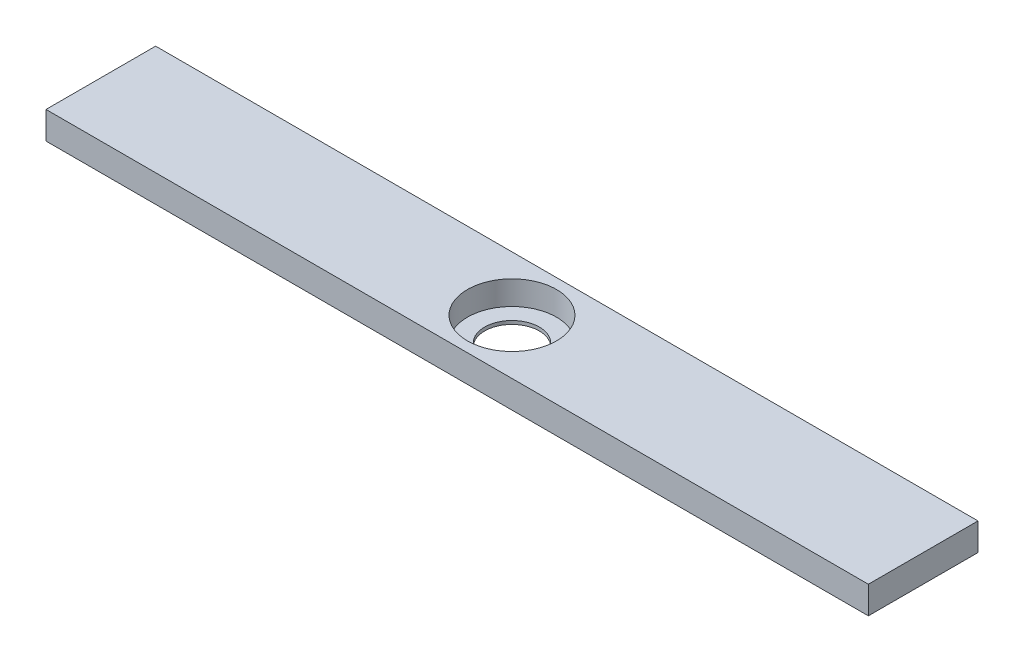
ISO-10303-21;
HEADER;
FILE_DESCRIPTION(('STEP AP214'),'2;1');
FILE_NAME('part.step','',(''),(''),'','','');
FILE_SCHEMA(('AUTOMOTIVE_DESIGN { 1 0 10303 214 1 1 1 1 }'));
ENDSEC;
DATA;
#1=APPLICATION_CONTEXT('core data for automotive mechanical design processes');
#2=APPLICATION_PROTOCOL_DEFINITION('international standard','automotive_design',2000,#1);
#3=PRODUCT_CONTEXT('',#1,'mechanical');
#4=PRODUCT('Part','Part','',(#3));
#5=PRODUCT_RELATED_PRODUCT_CATEGORY('part','',(#4));
#6=PRODUCT_DEFINITION_FORMATION('','',#4);
#7=PRODUCT_DEFINITION_CONTEXT('part definition',#1,'design');
#8=PRODUCT_DEFINITION('design','',#6,#7);
#9=PRODUCT_DEFINITION_SHAPE('','',#8);
#10=(LENGTH_UNIT() NAMED_UNIT(*) SI_UNIT(.MILLI.,.METRE.));
#11=(NAMED_UNIT(*) PLANE_ANGLE_UNIT() SI_UNIT($,.RADIAN.));
#12=(NAMED_UNIT(*) SI_UNIT($,.STERADIAN.) SOLID_ANGLE_UNIT());
#13=UNCERTAINTY_MEASURE_WITH_UNIT(LENGTH_MEASURE(1.E-05),#10,'distance_accuracy_value','');
#14=(GEOMETRIC_REPRESENTATION_CONTEXT(3) GLOBAL_UNCERTAINTY_ASSIGNED_CONTEXT((#13)) GLOBAL_UNIT_ASSIGNED_CONTEXT((#10,
#11,#12)) REPRESENTATION_CONTEXT('',''));
#15=CARTESIAN_POINT('',(0.,0.,0.));
#16=DIRECTION('',(0.,0.,1.));
#17=DIRECTION('',(1.,0.,0.));
#18=AXIS2_PLACEMENT_3D('',#15,#16,#17);
#19=CARTESIAN_POINT('',(190.5,12.7,-25.4));
#20=DIRECTION('',(-1.,0.,0.));
#21=DIRECTION('',(0.,0.,1.));
#22=AXIS2_PLACEMENT_3D('',#19,#20,#21);
#23=PLANE('',#22);
#24=DIRECTION('',(0.,0.,-1.));
#25=VECTOR('',#24,1.);
#26=CARTESIAN_POINT('',(190.5,0.,-25.4));
#27=LINE('',#26,#25);
#28=CARTESIAN_POINT('',(190.5,0.,25.4));
#29=VERTEX_POINT('',#28);
#30=CARTESIAN_POINT('',(190.5,0.,-25.4));
#31=VERTEX_POINT('',#30);
#32=EDGE_CURVE('E98',#29,#31,#27,.T.);
#33=ORIENTED_EDGE('',*,*,#32,.T.);
#34=DIRECTION('',(0.,-1.,0.));
#35=VECTOR('',#34,1.);
#36=CARTESIAN_POINT('',(190.5,12.7,-25.4));
#37=LINE('',#36,#35);
#38=CARTESIAN_POINT('',(190.5,12.7,-25.4));
#39=VERTEX_POINT('',#38);
#40=EDGE_CURVE('E11',#39,#31,#37,.T.);
#41=ORIENTED_EDGE('',*,*,#40,.F.);
#42=DIRECTION('',(0.,0.,-1.));
#43=VECTOR('',#42,1.);
#44=CARTESIAN_POINT('',(190.5,12.7,-25.4));
#45=LINE('',#44,#43);
#46=CARTESIAN_POINT('',(190.5,12.7,25.4));
#47=VERTEX_POINT('',#46);
#48=EDGE_CURVE('E86',#47,#39,#45,.T.);
#49=ORIENTED_EDGE('',*,*,#48,.F.);
#50=DIRECTION('',(0.,-1.,0.));
#51=VECTOR('',#50,1.);
#52=CARTESIAN_POINT('',(190.5,12.7,25.4));
#53=LINE('',#52,#51);
#54=EDGE_CURVE('E94',#47,#29,#53,.T.);
#55=ORIENTED_EDGE('',*,*,#54,.T.);
#56=EDGE_LOOP('',(#33,#41,#49,#55));
#57=FACE_BOUND('',#56,.T.);
#58=ADVANCED_FACE('F35',(#57),#23,.F.);
#59=CARTESIAN_POINT('',(-190.5,12.7,-25.4));
#60=DIRECTION('',(0.,0.,1.));
#61=DIRECTION('',(1.,0.,0.));
#62=AXIS2_PLACEMENT_3D('',#59,#60,#61);
#63=PLANE('',#62);
#64=DIRECTION('',(-1.,0.,0.));
#65=VECTOR('',#64,1.);
#66=CARTESIAN_POINT('',(-190.5,0.,-25.4));
#67=LINE('',#66,#65);
#68=CARTESIAN_POINT('',(-190.5,0.,-25.4));
#69=VERTEX_POINT('',#68);
#70=EDGE_CURVE('E90',#31,#69,#67,.T.);
#71=ORIENTED_EDGE('',*,*,#70,.T.);
#72=DIRECTION('',(0.,-1.,0.));
#73=VECTOR('',#72,1.);
#74=CARTESIAN_POINT('',(-190.5,12.7,-25.4));
#75=LINE('',#74,#73);
#76=CARTESIAN_POINT('',(-190.5,12.7,-25.4));
#77=VERTEX_POINT('',#76);
#78=EDGE_CURVE('E43',#77,#69,#75,.T.);
#79=ORIENTED_EDGE('',*,*,#78,.F.);
#80=DIRECTION('',(-1.,0.,0.));
#81=VECTOR('',#80,1.);
#82=CARTESIAN_POINT('',(-190.5,12.7,-25.4));
#83=LINE('',#82,#81);
#84=EDGE_CURVE('E81',#39,#77,#83,.T.);
#85=ORIENTED_EDGE('',*,*,#84,.F.);
#86=ORIENTED_EDGE('',*,*,#40,.T.);
#87=EDGE_LOOP('',(#71,#79,#85,#86));
#88=FACE_BOUND('',#87,.T.);
#89=ADVANCED_FACE('F89',(#88),#63,.F.);
#90=CARTESIAN_POINT('',(-190.5,12.7,-25.4));
#91=DIRECTION('',(1.,0.,0.));
#92=DIRECTION('',(0.,0.,-1.));
#93=AXIS2_PLACEMENT_3D('',#90,#91,#92);
#94=PLANE('',#93);
#95=DIRECTION('',(0.,0.,1.));
#96=VECTOR('',#95,1.);
#97=CARTESIAN_POINT('',(-190.5,0.,-25.4));
#98=LINE('',#97,#96);
#99=CARTESIAN_POINT('',(-190.5,0.,25.4));
#100=VERTEX_POINT('',#99);
#101=EDGE_CURVE('E68',#69,#100,#98,.T.);
#102=ORIENTED_EDGE('',*,*,#101,.T.);
#103=DIRECTION('',(0.,-1.,0.));
#104=VECTOR('',#103,1.);
#105=CARTESIAN_POINT('',(-190.5,12.7,25.4));
#106=LINE('',#105,#104);
#107=CARTESIAN_POINT('',(-190.5,12.7,25.4));
#108=VERTEX_POINT('',#107);
#109=EDGE_CURVE('E91',#108,#100,#106,.T.);
#110=ORIENTED_EDGE('',*,*,#109,.F.);
#111=DIRECTION('',(0.,0.,1.));
#112=VECTOR('',#111,1.);
#113=CARTESIAN_POINT('',(-190.5,12.7,-25.4));
#114=LINE('',#113,#112);
#115=EDGE_CURVE('E84',#77,#108,#114,.T.);
#116=ORIENTED_EDGE('',*,*,#115,.F.);
#117=ORIENTED_EDGE('',*,*,#78,.T.);
#118=EDGE_LOOP('',(#102,#110,#116,#117));
#119=FACE_BOUND('',#118,.T.);
#120=ADVANCED_FACE('F92',(#119),#94,.F.);
#121=CARTESIAN_POINT('',(-190.5,12.7,25.4));
#122=DIRECTION('',(0.,0.,-1.));
#123=DIRECTION('',(-1.,0.,0.));
#124=AXIS2_PLACEMENT_3D('',#121,#122,#123);
#125=PLANE('',#124);
#126=DIRECTION('',(1.,0.,0.));
#127=VECTOR('',#126,1.);
#128=CARTESIAN_POINT('',(-190.5,0.,25.4));
#129=LINE('',#128,#127);
#130=EDGE_CURVE('E74',#100,#29,#129,.T.);
#131=ORIENTED_EDGE('',*,*,#130,.T.);
#132=ORIENTED_EDGE('',*,*,#54,.F.);
#133=DIRECTION('',(1.,0.,0.));
#134=VECTOR('',#133,1.);
#135=CARTESIAN_POINT('',(-190.5,12.7,25.4));
#136=LINE('',#135,#134);
#137=EDGE_CURVE('E51',#108,#47,#136,.T.);
#138=ORIENTED_EDGE('',*,*,#137,.F.);
#139=ORIENTED_EDGE('',*,*,#109,.T.);
#140=EDGE_LOOP('',(#131,#132,#138,#139));
#141=FACE_BOUND('',#140,.T.);
#142=ADVANCED_FACE('F106',(#141),#125,.F.);
#143=CARTESIAN_POINT('',(190.5,12.7,25.4));
#144=DIRECTION('',(0.,1.,0.));
#145=DIRECTION('',(0.,0.,1.));
#146=AXIS2_PLACEMENT_3D('',#143,#144,#145);
#147=PLANE('',#146);
#148=CARTESIAN_POINT('',(0.,12.7,0.));
#149=DIRECTION('',(0.,1.,0.));
#150=DIRECTION('',(0.,0.,1.));
#151=AXIS2_PLACEMENT_3D('',#148,#149,#150);
#152=CIRCLE('',#151,20.6375);
#153=CARTESIAN_POINT('',(0.,12.7,20.6375));
#154=VERTEX_POINT('',#153);
#155=EDGE_CURVE('E112',#154,#154,#152,.T.);
#156=ORIENTED_EDGE('',*,*,#155,.F.);
#157=EDGE_LOOP('',(#156));
#158=FACE_BOUND('',#157,.T.);
#159=ORIENTED_EDGE('',*,*,#48,.T.);
#160=ORIENTED_EDGE('',*,*,#84,.T.);
#161=ORIENTED_EDGE('',*,*,#115,.T.);
#162=ORIENTED_EDGE('',*,*,#137,.T.);
#163=EDGE_LOOP('',(#159,#160,#161,#162));
#164=FACE_BOUND('',#163,.T.);
#165=ADVANCED_FACE('F82',(#158,#164),#147,.T.);
#166=CARTESIAN_POINT('',(190.5,0.,25.4));
#167=DIRECTION('',(0.,1.,0.));
#168=DIRECTION('',(0.,0.,1.));
#169=AXIS2_PLACEMENT_3D('',#166,#167,#168);
#170=PLANE('',#169);
#171=CARTESIAN_POINT('',(0.,0.,0.));
#172=DIRECTION('',(0.,1.,0.));
#173=DIRECTION('',(0.,0.,1.));
#174=AXIS2_PLACEMENT_3D('',#171,#172,#173);
#175=CIRCLE('',#174,12.7);
#176=CARTESIAN_POINT('',(0.,0.,12.7));
#177=VERTEX_POINT('',#176);
#178=EDGE_CURVE('E115',#177,#177,#175,.T.);
#179=ORIENTED_EDGE('',*,*,#178,.T.);
#180=EDGE_LOOP('',(#179));
#181=FACE_BOUND('',#180,.T.);
#182=ORIENTED_EDGE('',*,*,#32,.F.);
#183=ORIENTED_EDGE('',*,*,#130,.F.);
#184=ORIENTED_EDGE('',*,*,#101,.F.);
#185=ORIENTED_EDGE('',*,*,#70,.F.);
#186=EDGE_LOOP('',(#182,#183,#184,#185));
#187=FACE_BOUND('',#186,.T.);
#188=ADVANCED_FACE('F109',(#181,#187),#170,.F.);
#189=CARTESIAN_POINT('',(0.,1.5875,0.));
#190=DIRECTION('',(0.,1.,0.));
#191=DIRECTION('',(0.,0.,1.));
#192=AXIS2_PLACEMENT_3D('',#189,#190,#191);
#193=CYLINDRICAL_SURFACE('',#192,20.6375);
#194=CARTESIAN_POINT('',(0.,1.5875,0.));
#195=DIRECTION('',(0.,1.,0.));
#196=DIRECTION('',(0.,0.,1.));
#197=AXIS2_PLACEMENT_3D('',#194,#195,#196);
#198=CIRCLE('',#197,20.6375);
#199=CARTESIAN_POINT('',(0.,1.5875,20.6375));
#200=VERTEX_POINT('',#199);
#201=EDGE_CURVE('E101',#200,#200,#198,.T.);
#202=ORIENTED_EDGE('',*,*,#201,.F.);
#203=EDGE_LOOP('',(#202));
#204=FACE_BOUND('',#203,.T.);
#205=ORIENTED_EDGE('',*,*,#155,.T.);
#206=EDGE_LOOP('',(#205));
#207=FACE_BOUND('',#206,.T.);
#208=ADVANCED_FACE('F134',(#204,#207),#193,.F.);
#209=CARTESIAN_POINT('',(0.,1.5875,0.));
#210=DIRECTION('',(0.,1.,0.));
#211=DIRECTION('',(0.,0.,1.));
#212=AXIS2_PLACEMENT_3D('',#209,#210,#211);
#213=PLANE('',#212);
#214=CARTESIAN_POINT('',(0.,1.5875,0.));
#215=DIRECTION('',(0.,1.,0.));
#216=DIRECTION('',(0.,0.,1.));
#217=AXIS2_PLACEMENT_3D('',#214,#215,#216);
#218=CIRCLE('',#217,12.7);
#219=CARTESIAN_POINT('',(0.,1.5875,12.7));
#220=VERTEX_POINT('',#219);
#221=EDGE_CURVE('E118',#220,#220,#218,.T.);
#222=ORIENTED_EDGE('',*,*,#221,.F.);
#223=EDGE_LOOP('',(#222));
#224=FACE_BOUND('',#223,.T.);
#225=ORIENTED_EDGE('',*,*,#201,.T.);
#226=EDGE_LOOP('',(#225));
#227=FACE_BOUND('',#226,.T.);
#228=ADVANCED_FACE('F128',(#224,#227),#213,.T.);
#229=CARTESIAN_POINT('',(0.,0.,0.));
#230=DIRECTION('',(0.,1.,0.));
#231=DIRECTION('',(0.,0.,1.));
#232=AXIS2_PLACEMENT_3D('',#229,#230,#231);
#233=CYLINDRICAL_SURFACE('',#232,12.7);
#234=ORIENTED_EDGE('',*,*,#178,.F.);
#235=EDGE_LOOP('',(#234));
#236=FACE_BOUND('',#235,.T.);
#237=ORIENTED_EDGE('',*,*,#221,.T.);
#238=EDGE_LOOP('',(#237));
#239=FACE_BOUND('',#238,.T.);
#240=ADVANCED_FACE('F125',(#236,#239),#233,.F.);
#241=CLOSED_SHELL('',(#58,#89,#120,#142,#165,#188,#208,#228,#240));
#242=MANIFOLD_SOLID_BREP('B2',#241);
#243=ADVANCED_BREP_SHAPE_REPRESENTATION('',(#18,#242),#14);
#244=SHAPE_DEFINITION_REPRESENTATION(#9,#243);
ENDSEC;
END-ISO-10303-21;
